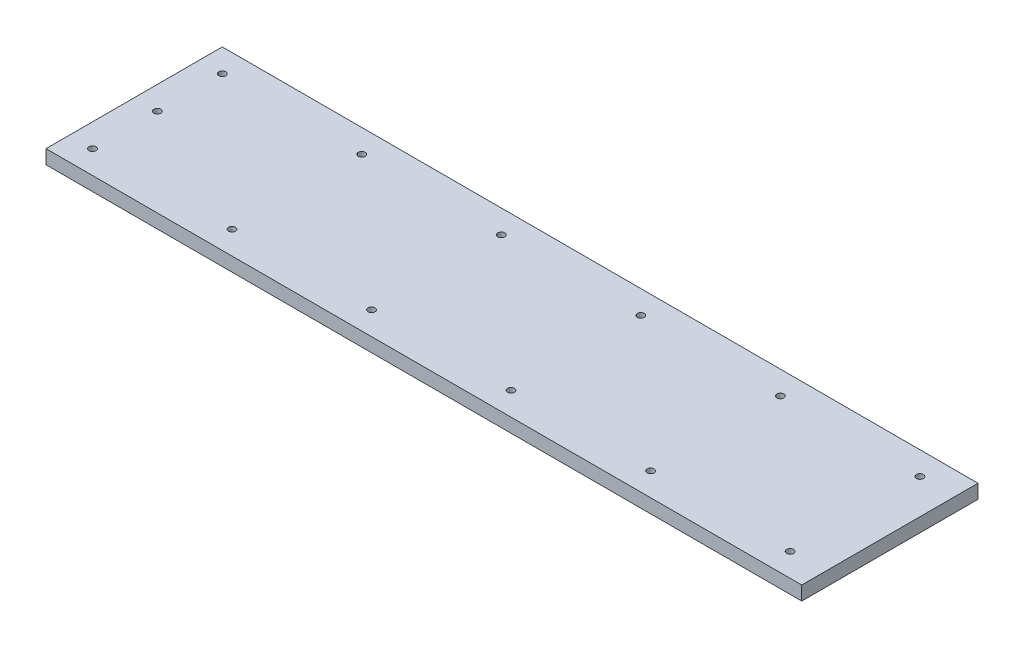
ISO-10303-21;
HEADER;
FILE_DESCRIPTION(('STEP AP214'),'2;1');
FILE_NAME('part.step','',(''),(''),'','','');
FILE_SCHEMA(('AUTOMOTIVE_DESIGN { 1 0 10303 214 1 1 1 1 }'));
ENDSEC;
DATA;
#1=APPLICATION_CONTEXT('core data for automotive mechanical design processes');
#2=APPLICATION_PROTOCOL_DEFINITION('international standard','automotive_design',2000,#1);
#3=PRODUCT_CONTEXT('',#1,'mechanical');
#4=PRODUCT('Part','Part','',(#3));
#5=PRODUCT_RELATED_PRODUCT_CATEGORY('part','',(#4));
#6=PRODUCT_DEFINITION_FORMATION('','',#4);
#7=PRODUCT_DEFINITION_CONTEXT('part definition',#1,'design');
#8=PRODUCT_DEFINITION('design','',#6,#7);
#9=PRODUCT_DEFINITION_SHAPE('','',#8);
#10=(LENGTH_UNIT() NAMED_UNIT(*) SI_UNIT(.MILLI.,.METRE.));
#11=(NAMED_UNIT(*) PLANE_ANGLE_UNIT() SI_UNIT($,.RADIAN.));
#12=(NAMED_UNIT(*) SI_UNIT($,.STERADIAN.) SOLID_ANGLE_UNIT());
#13=UNCERTAINTY_MEASURE_WITH_UNIT(LENGTH_MEASURE(1.E-05),#10,'distance_accuracy_value','');
#14=(GEOMETRIC_REPRESENTATION_CONTEXT(3) GLOBAL_UNCERTAINTY_ASSIGNED_CONTEXT((#13)) GLOBAL_UNIT_ASSIGNED_CONTEXT((#10,
#11,#12)) REPRESENTATION_CONTEXT('',''));
#15=CARTESIAN_POINT('',(0.,0.,0.));
#16=DIRECTION('',(0.,0.,1.));
#17=DIRECTION('',(1.,0.,0.));
#18=AXIS2_PLACEMENT_3D('',#15,#16,#17);
#19=CARTESIAN_POINT('',(0.,6.,0.));
#20=DIRECTION('',(0.,1.,0.));
#21=DIRECTION('',(0.,0.,1.));
#22=AXIS2_PLACEMENT_3D('',#19,#20,#21);
#23=PLANE('',#22);
#24=CARTESIAN_POINT('',(87.5,6.,0.799999999999988));
#25=DIRECTION('',(0.,1.,0.));
#26=DIRECTION('',(0.,0.,1.));
#27=AXIS2_PLACEMENT_3D('',#24,#25,#26);
#28=CIRCLE('',#27,1.5);
#29=CARTESIAN_POINT('',(87.5,6.,2.29999999999999));
#30=VERTEX_POINT('',#29);
#31=EDGE_CURVE('E214',#30,#30,#28,.T.);
#32=ORIENTED_EDGE('',*,*,#31,.F.);
#33=EDGE_LOOP('',(#32));
#34=FACE_BOUND('',#33,.T.);
#35=CARTESIAN_POINT('',(-32.5,6.,0.799999999999988));
#36=DIRECTION('',(0.,1.,0.));
#37=DIRECTION('',(0.,0.,1.));
#38=AXIS2_PLACEMENT_3D('',#35,#36,#37);
#39=CIRCLE('',#38,1.5);
#40=CARTESIAN_POINT('',(-32.5,6.,2.29999999999999));
#41=VERTEX_POINT('',#40);
#42=EDGE_CURVE('E198',#41,#41,#39,.T.);
#43=ORIENTED_EDGE('',*,*,#42,.F.);
#44=EDGE_LOOP('',(#43));
#45=FACE_BOUND('',#44,.T.);
#46=CARTESIAN_POINT('',(-152.5,6.,-27.1));
#47=DIRECTION('',(0.,1.,0.));
#48=DIRECTION('',(0.,0.,1.));
#49=AXIS2_PLACEMENT_3D('',#46,#47,#48);
#50=CIRCLE('',#49,1.5);
#51=CARTESIAN_POINT('',(-152.5,6.,-25.6));
#52=VERTEX_POINT('',#51);
#53=EDGE_CURVE('E182',#52,#52,#50,.T.);
#54=ORIENTED_EDGE('',*,*,#53,.F.);
#55=EDGE_LOOP('',(#54));
#56=FACE_BOUND('',#55,.T.);
#57=CARTESIAN_POINT('',(87.5,6.,-55.));
#58=DIRECTION('',(0.,1.,0.));
#59=DIRECTION('',(0.,0.,1.));
#60=AXIS2_PLACEMENT_3D('',#57,#58,#59);
#61=CIRCLE('',#60,1.5);
#62=CARTESIAN_POINT('',(87.5,6.,-53.5));
#63=VERTEX_POINT('',#62);
#64=EDGE_CURVE('E166',#63,#63,#61,.T.);
#65=ORIENTED_EDGE('',*,*,#64,.F.);
#66=EDGE_LOOP('',(#65));
#67=FACE_BOUND('',#66,.T.);
#68=CARTESIAN_POINT('',(-32.5,6.,-55.));
#69=DIRECTION('',(0.,1.,0.));
#70=DIRECTION('',(0.,0.,1.));
#71=AXIS2_PLACEMENT_3D('',#68,#69,#70);
#72=CIRCLE('',#71,1.5);
#73=CARTESIAN_POINT('',(-32.5,6.,-53.5));
#74=VERTEX_POINT('',#73);
#75=EDGE_CURVE('E150',#74,#74,#72,.T.);
#76=ORIENTED_EDGE('',*,*,#75,.F.);
#77=EDGE_LOOP('',(#76));
#78=FACE_BOUND('',#77,.T.);
#79=CARTESIAN_POINT('',(-152.5,6.,0.799999999999988));
#80=DIRECTION('',(0.,1.,0.));
#81=DIRECTION('',(0.,0.,1.));
#82=AXIS2_PLACEMENT_3D('',#79,#80,#81);
#83=CIRCLE('',#82,1.5);
#84=CARTESIAN_POINT('',(-152.5,6.,2.29999999999999));
#85=VERTEX_POINT('',#84);
#86=EDGE_CURVE('E134',#85,#85,#83,.T.);
#87=ORIENTED_EDGE('',*,*,#86,.F.);
#88=EDGE_LOOP('',(#87));
#89=FACE_BOUND('',#88,.T.);
#90=DIRECTION('',(0.,0.,1.));
#91=VECTOR('',#90,1.);
#92=CARTESIAN_POINT('',(-162.5,6.,-65.));
#93=LINE('',#92,#91);
#94=CARTESIAN_POINT('',(-162.5,6.,-65.));
#95=VERTEX_POINT('',#94);
#96=CARTESIAN_POINT('',(-162.5,6.,10.8));
#97=VERTEX_POINT('',#96);
#98=EDGE_CURVE('E92',#95,#97,#93,.T.);
#99=ORIENTED_EDGE('',*,*,#98,.T.);
#100=DIRECTION('',(1.,0.,0.));
#101=VECTOR('',#100,1.);
#102=CARTESIAN_POINT('',(-162.5,6.,10.8));
#103=LINE('',#102,#101);
#104=CARTESIAN_POINT('',(162.5,6.,10.8));
#105=VERTEX_POINT('',#104);
#106=EDGE_CURVE('E87',#97,#105,#103,.T.);
#107=ORIENTED_EDGE('',*,*,#106,.T.);
#108=DIRECTION('',(0.,0.,-1.));
#109=VECTOR('',#108,1.);
#110=CARTESIAN_POINT('',(162.5,6.,-65.));
#111=LINE('',#110,#109);
#112=CARTESIAN_POINT('',(162.5,6.,-65.));
#113=VERTEX_POINT('',#112);
#114=EDGE_CURVE('E90',#105,#113,#111,.T.);
#115=ORIENTED_EDGE('',*,*,#114,.T.);
#116=DIRECTION('',(-1.,0.,0.));
#117=VECTOR('',#116,1.);
#118=CARTESIAN_POINT('',(-162.5,6.,-65.));
#119=LINE('',#118,#117);
#120=EDGE_CURVE('E57',#113,#95,#119,.T.);
#121=ORIENTED_EDGE('',*,*,#120,.T.);
#122=EDGE_LOOP('',(#99,#107,#115,#121));
#123=FACE_BOUND('',#122,.T.);
#124=CARTESIAN_POINT('',(-152.5,6.,-55.));
#125=DIRECTION('',(0.,1.,0.));
#126=DIRECTION('',(0.,0.,1.));
#127=AXIS2_PLACEMENT_3D('',#124,#125,#126);
#128=CIRCLE('',#127,1.5);
#129=CARTESIAN_POINT('',(-152.5,6.,-53.5));
#130=VERTEX_POINT('',#129);
#131=EDGE_CURVE('E112',#130,#130,#128,.T.);
#132=ORIENTED_EDGE('',*,*,#131,.F.);
#133=EDGE_LOOP('',(#132));
#134=FACE_BOUND('',#133,.T.);
#135=CARTESIAN_POINT('',(-92.5,6.,-55.));
#136=DIRECTION('',(0.,1.,0.));
#137=DIRECTION('',(0.,0.,1.));
#138=AXIS2_PLACEMENT_3D('',#135,#136,#137);
#139=CIRCLE('',#138,1.5);
#140=CARTESIAN_POINT('',(-92.5,6.,-53.5));
#141=VERTEX_POINT('',#140);
#142=EDGE_CURVE('E142',#141,#141,#139,.T.);
#143=ORIENTED_EDGE('',*,*,#142,.F.);
#144=EDGE_LOOP('',(#143));
#145=FACE_BOUND('',#144,.T.);
#146=CARTESIAN_POINT('',(27.5,6.,-55.));
#147=DIRECTION('',(0.,1.,0.));
#148=DIRECTION('',(0.,0.,1.));
#149=AXIS2_PLACEMENT_3D('',#146,#147,#148);
#150=CIRCLE('',#149,1.5);
#151=CARTESIAN_POINT('',(27.5,6.,-53.5));
#152=VERTEX_POINT('',#151);
#153=EDGE_CURVE('E158',#152,#152,#150,.T.);
#154=ORIENTED_EDGE('',*,*,#153,.F.);
#155=EDGE_LOOP('',(#154));
#156=FACE_BOUND('',#155,.T.);
#157=CARTESIAN_POINT('',(147.5,6.,-55.));
#158=DIRECTION('',(0.,1.,0.));
#159=DIRECTION('',(0.,0.,1.));
#160=AXIS2_PLACEMENT_3D('',#157,#158,#159);
#161=CIRCLE('',#160,1.5);
#162=CARTESIAN_POINT('',(147.5,6.,-53.5));
#163=VERTEX_POINT('',#162);
#164=EDGE_CURVE('E174',#163,#163,#161,.T.);
#165=ORIENTED_EDGE('',*,*,#164,.F.);
#166=EDGE_LOOP('',(#165));
#167=FACE_BOUND('',#166,.T.);
#168=CARTESIAN_POINT('',(-92.5,6.,0.799999999999988));
#169=DIRECTION('',(0.,1.,0.));
#170=DIRECTION('',(0.,0.,1.));
#171=AXIS2_PLACEMENT_3D('',#168,#169,#170);
#172=CIRCLE('',#171,1.5);
#173=CARTESIAN_POINT('',(-92.5,6.,2.29999999999999));
#174=VERTEX_POINT('',#173);
#175=EDGE_CURVE('E190',#174,#174,#172,.T.);
#176=ORIENTED_EDGE('',*,*,#175,.F.);
#177=EDGE_LOOP('',(#176));
#178=FACE_BOUND('',#177,.T.);
#179=CARTESIAN_POINT('',(27.5,6.,0.799999999999988));
#180=DIRECTION('',(0.,1.,0.));
#181=DIRECTION('',(0.,0.,1.));
#182=AXIS2_PLACEMENT_3D('',#179,#180,#181);
#183=CIRCLE('',#182,1.5);
#184=CARTESIAN_POINT('',(27.5,6.,2.29999999999999));
#185=VERTEX_POINT('',#184);
#186=EDGE_CURVE('E206',#185,#185,#183,.T.);
#187=ORIENTED_EDGE('',*,*,#186,.F.);
#188=EDGE_LOOP('',(#187));
#189=FACE_BOUND('',#188,.T.);
#190=CARTESIAN_POINT('',(147.5,6.,0.799999999999988));
#191=DIRECTION('',(0.,1.,0.));
#192=DIRECTION('',(0.,0.,1.));
#193=AXIS2_PLACEMENT_3D('',#190,#191,#192);
#194=CIRCLE('',#193,1.5);
#195=CARTESIAN_POINT('',(147.5,6.,2.29999999999999));
#196=VERTEX_POINT('',#195);
#197=EDGE_CURVE('E222',#196,#196,#194,.T.);
#198=ORIENTED_EDGE('',*,*,#197,.F.);
#199=EDGE_LOOP('',(#198));
#200=FACE_BOUND('',#199,.T.);
#201=ADVANCED_FACE('F39',(#34,#45,#56,#67,#78,#89,#123,#134,#145,#156,#167,#178,#189,#200),#23,.T.);
#202=CARTESIAN_POINT('',(0.,0.,0.));
#203=DIRECTION('',(0.,1.,0.));
#204=DIRECTION('',(0.,0.,1.));
#205=AXIS2_PLACEMENT_3D('',#202,#203,#204);
#206=PLANE('',#205);
#207=DIRECTION('',(0.,0.,1.));
#208=VECTOR('',#207,1.);
#209=CARTESIAN_POINT('',(-162.5,0.,-65.));
#210=LINE('',#209,#208);
#211=CARTESIAN_POINT('',(-162.5,0.,-65.));
#212=VERTEX_POINT('',#211);
#213=CARTESIAN_POINT('',(-162.5,0.,10.8));
#214=VERTEX_POINT('',#213);
#215=EDGE_CURVE('E108',#212,#214,#210,.T.);
#216=ORIENTED_EDGE('',*,*,#215,.F.);
#217=DIRECTION('',(-1.,0.,0.));
#218=VECTOR('',#217,1.);
#219=CARTESIAN_POINT('',(-162.5,0.,-65.));
#220=LINE('',#219,#218);
#221=CARTESIAN_POINT('',(162.5,0.,-65.));
#222=VERTEX_POINT('',#221);
#223=EDGE_CURVE('E80',#222,#212,#220,.T.);
#224=ORIENTED_EDGE('',*,*,#223,.F.);
#225=DIRECTION('',(0.,0.,-1.));
#226=VECTOR('',#225,1.);
#227=CARTESIAN_POINT('',(162.5,0.,-65.));
#228=LINE('',#227,#226);
#229=CARTESIAN_POINT('',(162.5,0.,10.8));
#230=VERTEX_POINT('',#229);
#231=EDGE_CURVE('E74',#230,#222,#228,.T.);
#232=ORIENTED_EDGE('',*,*,#231,.F.);
#233=DIRECTION('',(1.,0.,0.));
#234=VECTOR('',#233,1.);
#235=CARTESIAN_POINT('',(-162.5,0.,10.8));
#236=LINE('',#235,#234);
#237=EDGE_CURVE('E97',#214,#230,#236,.T.);
#238=ORIENTED_EDGE('',*,*,#237,.F.);
#239=EDGE_LOOP('',(#216,#224,#232,#238));
#240=FACE_BOUND('',#239,.T.);
#241=CARTESIAN_POINT('',(-152.5,0.,-55.));
#242=DIRECTION('',(0.,1.,0.));
#243=DIRECTION('',(0.,0.,1.));
#244=AXIS2_PLACEMENT_3D('',#241,#242,#243);
#245=CIRCLE('',#244,1.5);
#246=CARTESIAN_POINT('',(-152.5,0.,-53.5));
#247=VERTEX_POINT('',#246);
#248=EDGE_CURVE('E130',#247,#247,#245,.T.);
#249=ORIENTED_EDGE('',*,*,#248,.T.);
#250=EDGE_LOOP('',(#249));
#251=FACE_BOUND('',#250,.T.);
#252=CARTESIAN_POINT('',(-152.5,0.,0.799999999999988));
#253=DIRECTION('',(0.,1.,0.));
#254=DIRECTION('',(0.,0.,1.));
#255=AXIS2_PLACEMENT_3D('',#252,#253,#254);
#256=CIRCLE('',#255,1.5);
#257=CARTESIAN_POINT('',(-152.5,0.,2.29999999999999));
#258=VERTEX_POINT('',#257);
#259=EDGE_CURVE('E138',#258,#258,#256,.T.);
#260=ORIENTED_EDGE('',*,*,#259,.T.);
#261=EDGE_LOOP('',(#260));
#262=FACE_BOUND('',#261,.T.);
#263=CARTESIAN_POINT('',(-92.5,0.,-55.));
#264=DIRECTION('',(0.,1.,0.));
#265=DIRECTION('',(0.,0.,1.));
#266=AXIS2_PLACEMENT_3D('',#263,#264,#265);
#267=CIRCLE('',#266,1.5);
#268=CARTESIAN_POINT('',(-92.5,0.,-53.5));
#269=VERTEX_POINT('',#268);
#270=EDGE_CURVE('E146',#269,#269,#267,.T.);
#271=ORIENTED_EDGE('',*,*,#270,.T.);
#272=EDGE_LOOP('',(#271));
#273=FACE_BOUND('',#272,.T.);
#274=CARTESIAN_POINT('',(-32.5,0.,-55.));
#275=DIRECTION('',(0.,1.,0.));
#276=DIRECTION('',(0.,0.,1.));
#277=AXIS2_PLACEMENT_3D('',#274,#275,#276);
#278=CIRCLE('',#277,1.5);
#279=CARTESIAN_POINT('',(-32.5,0.,-53.5));
#280=VERTEX_POINT('',#279);
#281=EDGE_CURVE('E154',#280,#280,#278,.T.);
#282=ORIENTED_EDGE('',*,*,#281,.T.);
#283=EDGE_LOOP('',(#282));
#284=FACE_BOUND('',#283,.T.);
#285=CARTESIAN_POINT('',(27.5,0.,-55.));
#286=DIRECTION('',(0.,1.,0.));
#287=DIRECTION('',(0.,0.,1.));
#288=AXIS2_PLACEMENT_3D('',#285,#286,#287);
#289=CIRCLE('',#288,1.5);
#290=CARTESIAN_POINT('',(27.5,0.,-53.5));
#291=VERTEX_POINT('',#290);
#292=EDGE_CURVE('E162',#291,#291,#289,.T.);
#293=ORIENTED_EDGE('',*,*,#292,.T.);
#294=EDGE_LOOP('',(#293));
#295=FACE_BOUND('',#294,.T.);
#296=CARTESIAN_POINT('',(87.5,0.,-55.));
#297=DIRECTION('',(0.,1.,0.));
#298=DIRECTION('',(0.,0.,1.));
#299=AXIS2_PLACEMENT_3D('',#296,#297,#298);
#300=CIRCLE('',#299,1.5);
#301=CARTESIAN_POINT('',(87.5,0.,-53.5));
#302=VERTEX_POINT('',#301);
#303=EDGE_CURVE('E170',#302,#302,#300,.T.);
#304=ORIENTED_EDGE('',*,*,#303,.T.);
#305=EDGE_LOOP('',(#304));
#306=FACE_BOUND('',#305,.T.);
#307=CARTESIAN_POINT('',(147.5,0.,-55.));
#308=DIRECTION('',(0.,1.,0.));
#309=DIRECTION('',(0.,0.,1.));
#310=AXIS2_PLACEMENT_3D('',#307,#308,#309);
#311=CIRCLE('',#310,1.5);
#312=CARTESIAN_POINT('',(147.5,0.,-53.5));
#313=VERTEX_POINT('',#312);
#314=EDGE_CURVE('E178',#313,#313,#311,.T.);
#315=ORIENTED_EDGE('',*,*,#314,.T.);
#316=EDGE_LOOP('',(#315));
#317=FACE_BOUND('',#316,.T.);
#318=CARTESIAN_POINT('',(-152.5,0.,-27.1));
#319=DIRECTION('',(0.,1.,0.));
#320=DIRECTION('',(0.,0.,1.));
#321=AXIS2_PLACEMENT_3D('',#318,#319,#320);
#322=CIRCLE('',#321,1.5);
#323=CARTESIAN_POINT('',(-152.5,0.,-25.6));
#324=VERTEX_POINT('',#323);
#325=EDGE_CURVE('E186',#324,#324,#322,.T.);
#326=ORIENTED_EDGE('',*,*,#325,.T.);
#327=EDGE_LOOP('',(#326));
#328=FACE_BOUND('',#327,.T.);
#329=CARTESIAN_POINT('',(-92.5,0.,0.799999999999988));
#330=DIRECTION('',(0.,1.,0.));
#331=DIRECTION('',(0.,0.,1.));
#332=AXIS2_PLACEMENT_3D('',#329,#330,#331);
#333=CIRCLE('',#332,1.5);
#334=CARTESIAN_POINT('',(-92.5,0.,2.29999999999999));
#335=VERTEX_POINT('',#334);
#336=EDGE_CURVE('E194',#335,#335,#333,.T.);
#337=ORIENTED_EDGE('',*,*,#336,.T.);
#338=EDGE_LOOP('',(#337));
#339=FACE_BOUND('',#338,.T.);
#340=CARTESIAN_POINT('',(-32.5,0.,0.799999999999988));
#341=DIRECTION('',(0.,1.,0.));
#342=DIRECTION('',(0.,0.,1.));
#343=AXIS2_PLACEMENT_3D('',#340,#341,#342);
#344=CIRCLE('',#343,1.5);
#345=CARTESIAN_POINT('',(-32.5,0.,2.29999999999999));
#346=VERTEX_POINT('',#345);
#347=EDGE_CURVE('E202',#346,#346,#344,.T.);
#348=ORIENTED_EDGE('',*,*,#347,.T.);
#349=EDGE_LOOP('',(#348));
#350=FACE_BOUND('',#349,.T.);
#351=CARTESIAN_POINT('',(27.5,0.,0.799999999999988));
#352=DIRECTION('',(0.,1.,0.));
#353=DIRECTION('',(0.,0.,1.));
#354=AXIS2_PLACEMENT_3D('',#351,#352,#353);
#355=CIRCLE('',#354,1.5);
#356=CARTESIAN_POINT('',(27.5,0.,2.29999999999999));
#357=VERTEX_POINT('',#356);
#358=EDGE_CURVE('E210',#357,#357,#355,.T.);
#359=ORIENTED_EDGE('',*,*,#358,.T.);
#360=EDGE_LOOP('',(#359));
#361=FACE_BOUND('',#360,.T.);
#362=CARTESIAN_POINT('',(87.5,0.,0.799999999999988));
#363=DIRECTION('',(0.,1.,0.));
#364=DIRECTION('',(0.,0.,1.));
#365=AXIS2_PLACEMENT_3D('',#362,#363,#364);
#366=CIRCLE('',#365,1.5);
#367=CARTESIAN_POINT('',(87.5,0.,2.29999999999999));
#368=VERTEX_POINT('',#367);
#369=EDGE_CURVE('E218',#368,#368,#366,.T.);
#370=ORIENTED_EDGE('',*,*,#369,.T.);
#371=EDGE_LOOP('',(#370));
#372=FACE_BOUND('',#371,.T.);
#373=CARTESIAN_POINT('',(147.5,0.,0.799999999999988));
#374=DIRECTION('',(0.,1.,0.));
#375=DIRECTION('',(0.,0.,1.));
#376=AXIS2_PLACEMENT_3D('',#373,#374,#375);
#377=CIRCLE('',#376,1.5);
#378=CARTESIAN_POINT('',(147.5,0.,2.29999999999999));
#379=VERTEX_POINT('',#378);
#380=EDGE_CURVE('E226',#379,#379,#377,.T.);
#381=ORIENTED_EDGE('',*,*,#380,.T.);
#382=EDGE_LOOP('',(#381));
#383=FACE_BOUND('',#382,.T.);
#384=ADVANCED_FACE('F125',(#240,#251,#262,#273,#284,#295,#306,#317,#328,#339,#350,#361,#372,
#383),#206,.F.);
#385=CARTESIAN_POINT('',(-162.5,6.,-65.));
#386=DIRECTION('',(1.,0.,0.));
#387=DIRECTION('',(0.,0.,-1.));
#388=AXIS2_PLACEMENT_3D('',#385,#386,#387);
#389=PLANE('',#388);
#390=ORIENTED_EDGE('',*,*,#215,.T.);
#391=DIRECTION('',(0.,-1.,0.));
#392=VECTOR('',#391,1.);
#393=CARTESIAN_POINT('',(-162.5,6.,10.8));
#394=LINE('',#393,#392);
#395=EDGE_CURVE('E11',#97,#214,#394,.T.);
#396=ORIENTED_EDGE('',*,*,#395,.F.);
#397=ORIENTED_EDGE('',*,*,#98,.F.);
#398=DIRECTION('',(0.,-1.,0.));
#399=VECTOR('',#398,1.);
#400=CARTESIAN_POINT('',(-162.5,6.,-65.));
#401=LINE('',#400,#399);
#402=EDGE_CURVE('E104',#95,#212,#401,.T.);
#403=ORIENTED_EDGE('',*,*,#402,.T.);
#404=EDGE_LOOP('',(#390,#396,#397,#403));
#405=FACE_BOUND('',#404,.T.);
#406=ADVANCED_FACE('F41',(#405),#389,.F.);
#407=CARTESIAN_POINT('',(-162.5,6.,10.8));
#408=DIRECTION('',(0.,0.,-1.));
#409=DIRECTION('',(-1.,0.,0.));
#410=AXIS2_PLACEMENT_3D('',#407,#408,#409);
#411=PLANE('',#410);
#412=ORIENTED_EDGE('',*,*,#237,.T.);
#413=DIRECTION('',(0.,-1.,0.));
#414=VECTOR('',#413,1.);
#415=CARTESIAN_POINT('',(162.5,6.,10.8));
#416=LINE('',#415,#414);
#417=EDGE_CURVE('E49',#105,#230,#416,.T.);
#418=ORIENTED_EDGE('',*,*,#417,.F.);
#419=ORIENTED_EDGE('',*,*,#106,.F.);
#420=ORIENTED_EDGE('',*,*,#395,.T.);
#421=EDGE_LOOP('',(#412,#418,#419,#420));
#422=FACE_BOUND('',#421,.T.);
#423=ADVANCED_FACE('F96',(#422),#411,.F.);
#424=CARTESIAN_POINT('',(162.5,6.,-65.));
#425=DIRECTION('',(-1.,0.,0.));
#426=DIRECTION('',(0.,0.,1.));
#427=AXIS2_PLACEMENT_3D('',#424,#425,#426);
#428=PLANE('',#427);
#429=ORIENTED_EDGE('',*,*,#231,.T.);
#430=DIRECTION('',(0.,-1.,0.));
#431=VECTOR('',#430,1.);
#432=CARTESIAN_POINT('',(162.5,6.,-65.));
#433=LINE('',#432,#431);
#434=EDGE_CURVE('E99',#113,#222,#433,.T.);
#435=ORIENTED_EDGE('',*,*,#434,.F.);
#436=ORIENTED_EDGE('',*,*,#114,.F.);
#437=ORIENTED_EDGE('',*,*,#417,.T.);
#438=EDGE_LOOP('',(#429,#435,#436,#437));
#439=FACE_BOUND('',#438,.T.);
#440=ADVANCED_FACE('F100',(#439),#428,.F.);
#441=CARTESIAN_POINT('',(-162.5,6.,-65.));
#442=DIRECTION('',(0.,0.,1.));
#443=DIRECTION('',(1.,0.,0.));
#444=AXIS2_PLACEMENT_3D('',#441,#442,#443);
#445=PLANE('',#444);
#446=ORIENTED_EDGE('',*,*,#223,.T.);
#447=ORIENTED_EDGE('',*,*,#402,.F.);
#448=ORIENTED_EDGE('',*,*,#120,.F.);
#449=ORIENTED_EDGE('',*,*,#434,.T.);
#450=EDGE_LOOP('',(#446,#447,#448,#449));
#451=FACE_BOUND('',#450,.T.);
#452=ADVANCED_FACE('F122',(#451),#445,.F.);
#453=CARTESIAN_POINT('',(-152.5,6.,-55.));
#454=DIRECTION('',(0.,-1.,0.));
#455=DIRECTION('',(0.,0.,-1.));
#456=AXIS2_PLACEMENT_3D('',#453,#454,#455);
#457=CYLINDRICAL_SURFACE('',#456,1.5);
#458=ORIENTED_EDGE('',*,*,#131,.T.);
#459=EDGE_LOOP('',(#458));
#460=FACE_BOUND('',#459,.T.);
#461=ORIENTED_EDGE('',*,*,#248,.F.);
#462=EDGE_LOOP('',(#461));
#463=FACE_BOUND('',#462,.T.);
#464=ADVANCED_FACE('F247',(#460,#463),#457,.F.);
#465=CARTESIAN_POINT('',(-152.5,6.,0.799999999999988));
#466=DIRECTION('',(0.,-1.,0.));
#467=DIRECTION('',(0.,0.,-1.));
#468=AXIS2_PLACEMENT_3D('',#465,#466,#467);
#469=CYLINDRICAL_SURFACE('',#468,1.5);
#470=ORIENTED_EDGE('',*,*,#86,.T.);
#471=EDGE_LOOP('',(#470));
#472=FACE_BOUND('',#471,.T.);
#473=ORIENTED_EDGE('',*,*,#259,.F.);
#474=EDGE_LOOP('',(#473));
#475=FACE_BOUND('',#474,.T.);
#476=ADVANCED_FACE('F293',(#472,#475),#469,.F.);
#477=CARTESIAN_POINT('',(-92.5,6.,-55.));
#478=DIRECTION('',(0.,-1.,0.));
#479=DIRECTION('',(0.,0.,-1.));
#480=AXIS2_PLACEMENT_3D('',#477,#478,#479);
#481=CYLINDRICAL_SURFACE('',#480,1.5);
#482=ORIENTED_EDGE('',*,*,#142,.T.);
#483=EDGE_LOOP('',(#482));
#484=FACE_BOUND('',#483,.T.);
#485=ORIENTED_EDGE('',*,*,#270,.F.);
#486=EDGE_LOOP('',(#485));
#487=FACE_BOUND('',#486,.T.);
#488=ADVANCED_FACE('F301',(#484,#487),#481,.F.);
#489=CARTESIAN_POINT('',(-32.5,6.,-55.));
#490=DIRECTION('',(0.,-1.,0.));
#491=DIRECTION('',(0.,0.,-1.));
#492=AXIS2_PLACEMENT_3D('',#489,#490,#491);
#493=CYLINDRICAL_SURFACE('',#492,1.5);
#494=ORIENTED_EDGE('',*,*,#75,.T.);
#495=EDGE_LOOP('',(#494));
#496=FACE_BOUND('',#495,.T.);
#497=ORIENTED_EDGE('',*,*,#281,.F.);
#498=EDGE_LOOP('',(#497));
#499=FACE_BOUND('',#498,.T.);
#500=ADVANCED_FACE('F309',(#496,#499),#493,.F.);
#501=CARTESIAN_POINT('',(27.5,6.,-55.));
#502=DIRECTION('',(0.,-1.,0.));
#503=DIRECTION('',(0.,0.,-1.));
#504=AXIS2_PLACEMENT_3D('',#501,#502,#503);
#505=CYLINDRICAL_SURFACE('',#504,1.5);
#506=ORIENTED_EDGE('',*,*,#153,.T.);
#507=EDGE_LOOP('',(#506));
#508=FACE_BOUND('',#507,.T.);
#509=ORIENTED_EDGE('',*,*,#292,.F.);
#510=EDGE_LOOP('',(#509));
#511=FACE_BOUND('',#510,.T.);
#512=ADVANCED_FACE('F318',(#508,#511),#505,.F.);
#513=CARTESIAN_POINT('',(87.5,6.,-55.));
#514=DIRECTION('',(0.,-1.,0.));
#515=DIRECTION('',(0.,0.,-1.));
#516=AXIS2_PLACEMENT_3D('',#513,#514,#515);
#517=CYLINDRICAL_SURFACE('',#516,1.5);
#518=ORIENTED_EDGE('',*,*,#64,.T.);
#519=EDGE_LOOP('',(#518));
#520=FACE_BOUND('',#519,.T.);
#521=ORIENTED_EDGE('',*,*,#303,.F.);
#522=EDGE_LOOP('',(#521));
#523=FACE_BOUND('',#522,.T.);
#524=ADVANCED_FACE('F327',(#520,#523),#517,.F.);
#525=CARTESIAN_POINT('',(147.5,6.,-55.));
#526=DIRECTION('',(0.,-1.,0.));
#527=DIRECTION('',(0.,0.,-1.));
#528=AXIS2_PLACEMENT_3D('',#525,#526,#527);
#529=CYLINDRICAL_SURFACE('',#528,1.5);
#530=ORIENTED_EDGE('',*,*,#164,.T.);
#531=EDGE_LOOP('',(#530));
#532=FACE_BOUND('',#531,.T.);
#533=ORIENTED_EDGE('',*,*,#314,.F.);
#534=EDGE_LOOP('',(#533));
#535=FACE_BOUND('',#534,.T.);
#536=ADVANCED_FACE('F336',(#532,#535),#529,.F.);
#537=CARTESIAN_POINT('',(-152.5,6.,-27.1));
#538=DIRECTION('',(0.,-1.,0.));
#539=DIRECTION('',(0.,0.,-1.));
#540=AXIS2_PLACEMENT_3D('',#537,#538,#539);
#541=CYLINDRICAL_SURFACE('',#540,1.5);
#542=ORIENTED_EDGE('',*,*,#53,.T.);
#543=EDGE_LOOP('',(#542));
#544=FACE_BOUND('',#543,.T.);
#545=ORIENTED_EDGE('',*,*,#325,.F.);
#546=EDGE_LOOP('',(#545));
#547=FACE_BOUND('',#546,.T.);
#548=ADVANCED_FACE('F345',(#544,#547),#541,.F.);
#549=CARTESIAN_POINT('',(-92.5,6.,0.799999999999988));
#550=DIRECTION('',(0.,-1.,0.));
#551=DIRECTION('',(0.,0.,-1.));
#552=AXIS2_PLACEMENT_3D('',#549,#550,#551);
#553=CYLINDRICAL_SURFACE('',#552,1.5);
#554=ORIENTED_EDGE('',*,*,#175,.T.);
#555=EDGE_LOOP('',(#554));
#556=FACE_BOUND('',#555,.T.);
#557=ORIENTED_EDGE('',*,*,#336,.F.);
#558=EDGE_LOOP('',(#557));
#559=FACE_BOUND('',#558,.T.);
#560=ADVANCED_FACE('F354',(#556,#559),#553,.F.);
#561=CARTESIAN_POINT('',(-32.5,6.,0.799999999999988));
#562=DIRECTION('',(0.,-1.,0.));
#563=DIRECTION('',(0.,0.,-1.));
#564=AXIS2_PLACEMENT_3D('',#561,#562,#563);
#565=CYLINDRICAL_SURFACE('',#564,1.5);
#566=ORIENTED_EDGE('',*,*,#42,.T.);
#567=EDGE_LOOP('',(#566));
#568=FACE_BOUND('',#567,.T.);
#569=ORIENTED_EDGE('',*,*,#347,.F.);
#570=EDGE_LOOP('',(#569));
#571=FACE_BOUND('',#570,.T.);
#572=ADVANCED_FACE('F363',(#568,#571),#565,.F.);
#573=CARTESIAN_POINT('',(27.5,6.,0.799999999999988));
#574=DIRECTION('',(0.,-1.,0.));
#575=DIRECTION('',(0.,0.,-1.));
#576=AXIS2_PLACEMENT_3D('',#573,#574,#575);
#577=CYLINDRICAL_SURFACE('',#576,1.5);
#578=ORIENTED_EDGE('',*,*,#186,.T.);
#579=EDGE_LOOP('',(#578));
#580=FACE_BOUND('',#579,.T.);
#581=ORIENTED_EDGE('',*,*,#358,.F.);
#582=EDGE_LOOP('',(#581));
#583=FACE_BOUND('',#582,.T.);
#584=ADVANCED_FACE('F372',(#580,#583),#577,.F.);
#585=CARTESIAN_POINT('',(87.5,6.,0.799999999999988));
#586=DIRECTION('',(0.,-1.,0.));
#587=DIRECTION('',(0.,0.,-1.));
#588=AXIS2_PLACEMENT_3D('',#585,#586,#587);
#589=CYLINDRICAL_SURFACE('',#588,1.5);
#590=ORIENTED_EDGE('',*,*,#31,.T.);
#591=EDGE_LOOP('',(#590));
#592=FACE_BOUND('',#591,.T.);
#593=ORIENTED_EDGE('',*,*,#369,.F.);
#594=EDGE_LOOP('',(#593));
#595=FACE_BOUND('',#594,.T.);
#596=ADVANCED_FACE('F381',(#592,#595),#589,.F.);
#597=CARTESIAN_POINT('',(147.5,6.,0.799999999999988));
#598=DIRECTION('',(0.,-1.,0.));
#599=DIRECTION('',(0.,0.,-1.));
#600=AXIS2_PLACEMENT_3D('',#597,#598,#599);
#601=CYLINDRICAL_SURFACE('',#600,1.5);
#602=ORIENTED_EDGE('',*,*,#197,.T.);
#603=EDGE_LOOP('',(#602));
#604=FACE_BOUND('',#603,.T.);
#605=ORIENTED_EDGE('',*,*,#380,.F.);
#606=EDGE_LOOP('',(#605));
#607=FACE_BOUND('',#606,.T.);
#608=ADVANCED_FACE('F234',(#604,#607),#601,.F.);
#609=CLOSED_SHELL('',(#201,#384,#406,#423,#440,#452,#464,#476,#488,#500,#512,#524,#536,#548,
#560,#572,#584,#596,#608));
#610=MANIFOLD_SOLID_BREP('B2',#609);
#611=ADVANCED_BREP_SHAPE_REPRESENTATION('',(#18,#610),#14);
#612=SHAPE_DEFINITION_REPRESENTATION(#9,#611);
ENDSEC;
END-ISO-10303-21;
